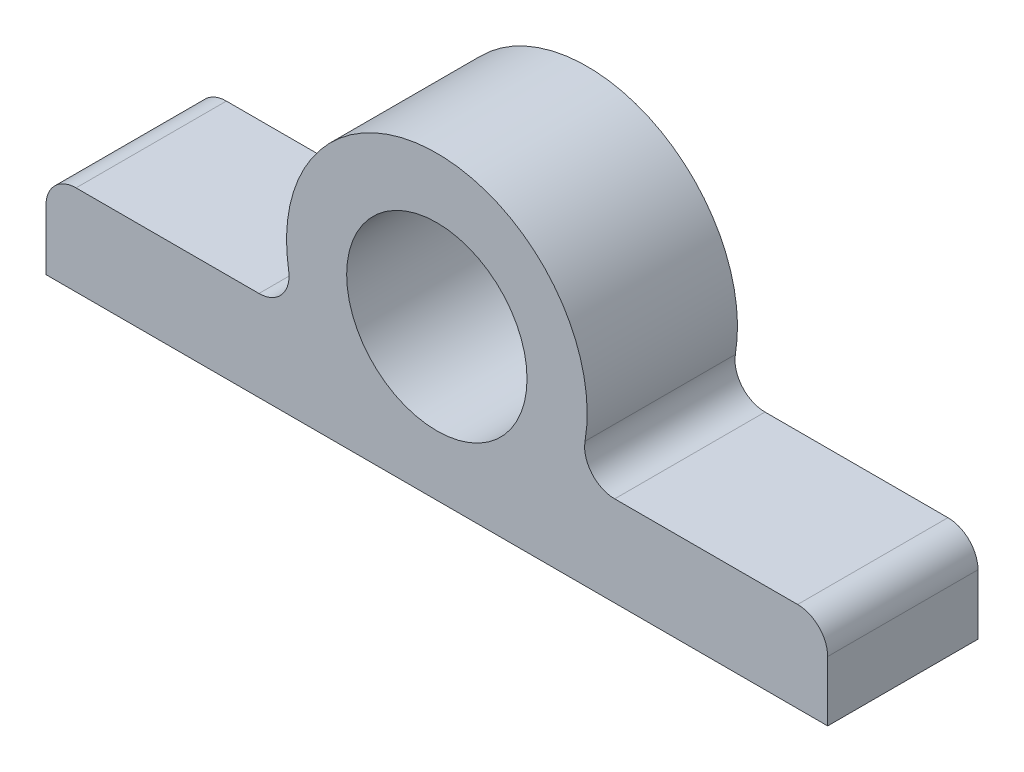
ISO-10303-21;
HEADER;
FILE_DESCRIPTION(('STEP AP214'),'2;1');
FILE_NAME('part.step','',(''),(''),'','','');
FILE_SCHEMA(('AUTOMOTIVE_DESIGN { 1 0 10303 214 1 1 1 1 }'));
ENDSEC;
DATA;
#1=APPLICATION_CONTEXT('core data for automotive mechanical design processes');
#2=APPLICATION_PROTOCOL_DEFINITION('international standard','automotive_design',2000,#1);
#3=PRODUCT_CONTEXT('',#1,'mechanical');
#4=PRODUCT('Part','Part','',(#3));
#5=PRODUCT_RELATED_PRODUCT_CATEGORY('part','',(#4));
#6=PRODUCT_DEFINITION_FORMATION('','',#4);
#7=PRODUCT_DEFINITION_CONTEXT('part definition',#1,'design');
#8=PRODUCT_DEFINITION('design','',#6,#7);
#9=PRODUCT_DEFINITION_SHAPE('','',#8);
#10=(LENGTH_UNIT() NAMED_UNIT(*) SI_UNIT(.MILLI.,.METRE.));
#11=(NAMED_UNIT(*) PLANE_ANGLE_UNIT() SI_UNIT($,.RADIAN.));
#12=(NAMED_UNIT(*) SI_UNIT($,.STERADIAN.) SOLID_ANGLE_UNIT());
#13=UNCERTAINTY_MEASURE_WITH_UNIT(LENGTH_MEASURE(1.E-05),#10,'distance_accuracy_value','');
#14=(GEOMETRIC_REPRESENTATION_CONTEXT(3) GLOBAL_UNCERTAINTY_ASSIGNED_CONTEXT((#13)) GLOBAL_UNIT_ASSIGNED_CONTEXT((#10,
#11,#12)) REPRESENTATION_CONTEXT('',''));
#15=CARTESIAN_POINT('',(0.,0.,0.));
#16=DIRECTION('',(0.,0.,1.));
#17=DIRECTION('',(1.,0.,0.));
#18=AXIS2_PLACEMENT_3D('',#15,#16,#17);
#19=CARTESIAN_POINT('',(29.5803989154981,-5.,25.));
#20=DIRECTION('',(0.,0.,-1.));
#21=DIRECTION('',(-1.,0.,0.));
#22=AXIS2_PLACEMENT_3D('',#19,#20,#21);
#23=PLANE('',#22);
#24=CARTESIAN_POINT('',(29.5803989154981,-5.,25.));
#25=DIRECTION('',(0.,0.,-1.));
#26=DIRECTION('',(-1.,0.,0.));
#27=AXIS2_PLACEMENT_3D('',#24,#25,#26);
#28=CIRCLE('',#27,5.);
#29=CARTESIAN_POINT('',(29.5803989154981,-10.,25.));
#30=VERTEX_POINT('',#29);
#31=CARTESIAN_POINT('',(24.6503324295817,-4.16666666666668,25.));
#32=VERTEX_POINT('',#31);
#33=EDGE_CURVE('E159',#30,#32,#28,.T.);
#34=ORIENTED_EDGE('',*,*,#33,.T.);
#35=CARTESIAN_POINT('',(0.,0.,25.));
#36=DIRECTION('',(0.,0.,1.));
#37=DIRECTION('',(1.,0.,0.));
#38=AXIS2_PLACEMENT_3D('',#35,#36,#37);
#39=CIRCLE('',#38,25.);
#40=CARTESIAN_POINT('',(-24.6503324295817,-4.16666666666667,25.));
#41=VERTEX_POINT('',#40);
#42=EDGE_CURVE('E97',#32,#41,#39,.T.);
#43=ORIENTED_EDGE('',*,*,#42,.T.);
#44=CARTESIAN_POINT('',(-29.5803989154981,-5.,25.));
#45=DIRECTION('',(0.,0.,-1.));
#46=DIRECTION('',(1.,0.,0.));
#47=AXIS2_PLACEMENT_3D('',#44,#45,#46);
#48=CIRCLE('',#47,5.);
#49=CARTESIAN_POINT('',(-29.5803989154981,-10.,25.));
#50=VERTEX_POINT('',#49);
#51=EDGE_CURVE('E180',#41,#50,#48,.T.);
#52=ORIENTED_EDGE('',*,*,#51,.T.);
#53=DIRECTION('',(-1.,0.,0.));
#54=VECTOR('',#53,1.);
#55=CARTESIAN_POINT('',(-60.,-10.,25.));
#56=LINE('',#55,#54);
#57=CARTESIAN_POINT('',(-60.,-10.,25.));
#58=VERTEX_POINT('',#57);
#59=EDGE_CURVE('E199',#50,#58,#56,.T.);
#60=ORIENTED_EDGE('',*,*,#59,.T.);
#61=CARTESIAN_POINT('',(-60.,-15.,25.));
#62=DIRECTION('',(0.,0.,1.));
#63=DIRECTION('',(-1.,0.,0.));
#64=AXIS2_PLACEMENT_3D('',#61,#62,#63);
#65=CIRCLE('',#64,5.);
#66=CARTESIAN_POINT('',(-65.,-15.,25.));
#67=VERTEX_POINT('',#66);
#68=EDGE_CURVE('E196',#58,#67,#65,.T.);
#69=ORIENTED_EDGE('',*,*,#68,.T.);
#70=DIRECTION('',(0.,-1.,0.));
#71=VECTOR('',#70,1.);
#72=CARTESIAN_POINT('',(-65.,-25.,25.));
#73=LINE('',#72,#71);
#74=CARTESIAN_POINT('',(-65.,-25.,25.));
#75=VERTEX_POINT('',#74);
#76=EDGE_CURVE('E198',#67,#75,#73,.T.);
#77=ORIENTED_EDGE('',*,*,#76,.T.);
#78=DIRECTION('',(1.,0.,0.));
#79=VECTOR('',#78,1.);
#80=CARTESIAN_POINT('',(-65.,-25.,25.));
#81=LINE('',#80,#79);
#82=CARTESIAN_POINT('',(65.,-25.,25.));
#83=VERTEX_POINT('',#82);
#84=EDGE_CURVE('E122',#75,#83,#81,.T.);
#85=ORIENTED_EDGE('',*,*,#84,.T.);
#86=DIRECTION('',(0.,1.,0.));
#87=VECTOR('',#86,1.);
#88=CARTESIAN_POINT('',(65.,-25.,25.));
#89=LINE('',#88,#87);
#90=CARTESIAN_POINT('',(65.,-15.,25.));
#91=VERTEX_POINT('',#90);
#92=EDGE_CURVE('E116',#83,#91,#89,.T.);
#93=ORIENTED_EDGE('',*,*,#92,.T.);
#94=CARTESIAN_POINT('',(60.,-15.,25.));
#95=DIRECTION('',(0.,0.,1.));
#96=DIRECTION('',(1.,0.,0.));
#97=AXIS2_PLACEMENT_3D('',#94,#95,#96);
#98=CIRCLE('',#97,5.);
#99=CARTESIAN_POINT('',(60.,-10.,25.));
#100=VERTEX_POINT('',#99);
#101=EDGE_CURVE('E120',#91,#100,#98,.T.);
#102=ORIENTED_EDGE('',*,*,#101,.T.);
#103=DIRECTION('',(-1.,0.,0.));
#104=VECTOR('',#103,1.);
#105=CARTESIAN_POINT('',(60.,-10.,25.));
#106=LINE('',#105,#104);
#107=EDGE_CURVE('E48',#100,#30,#106,.T.);
#108=ORIENTED_EDGE('',*,*,#107,.T.);
#109=EDGE_LOOP('',(#34,#43,#52,#60,#69,#77,#85,#93,#102,#108));
#110=FACE_BOUND('',#109,.T.);
#111=CARTESIAN_POINT('',(0.,0.,25.));
#112=DIRECTION('',(0.,0.,1.));
#113=DIRECTION('',(1.,0.,0.));
#114=AXIS2_PLACEMENT_3D('',#111,#112,#113);
#115=CIRCLE('',#114,15.);
#116=CARTESIAN_POINT('',(15.,0.,25.));
#117=VERTEX_POINT('',#116);
#118=EDGE_CURVE('E144',#117,#117,#115,.T.);
#119=ORIENTED_EDGE('',*,*,#118,.F.);
#120=EDGE_LOOP('',(#119));
#121=FACE_BOUND('',#120,.T.);
#122=ADVANCED_FACE('F31',(#110,#121),#23,.F.);
#123=CARTESIAN_POINT('',(29.5803989154981,-5.,0.));
#124=DIRECTION('',(0.,0.,-1.));
#125=DIRECTION('',(-1.,0.,0.));
#126=AXIS2_PLACEMENT_3D('',#123,#124,#125);
#127=PLANE('',#126);
#128=CARTESIAN_POINT('',(29.5803989154981,-5.,0.));
#129=DIRECTION('',(0.,0.,-1.));
#130=DIRECTION('',(-1.,0.,0.));
#131=AXIS2_PLACEMENT_3D('',#128,#129,#130);
#132=CIRCLE('',#131,5.);
#133=CARTESIAN_POINT('',(29.5803989154981,-10.,0.));
#134=VERTEX_POINT('',#133);
#135=CARTESIAN_POINT('',(24.6503324295817,-4.16666666666668,0.));
#136=VERTEX_POINT('',#135);
#137=EDGE_CURVE('E140',#134,#136,#132,.T.);
#138=ORIENTED_EDGE('',*,*,#137,.F.);
#139=DIRECTION('',(-1.,0.,0.));
#140=VECTOR('',#139,1.);
#141=CARTESIAN_POINT('',(60.,-10.,0.));
#142=LINE('',#141,#140);
#143=CARTESIAN_POINT('',(60.,-10.,0.));
#144=VERTEX_POINT('',#143);
#145=EDGE_CURVE('E89',#144,#134,#142,.T.);
#146=ORIENTED_EDGE('',*,*,#145,.F.);
#147=CARTESIAN_POINT('',(60.,-15.,0.));
#148=DIRECTION('',(0.,0.,1.));
#149=DIRECTION('',(1.,0.,0.));
#150=AXIS2_PLACEMENT_3D('',#147,#148,#149);
#151=CIRCLE('',#150,5.);
#152=CARTESIAN_POINT('',(65.,-15.,0.));
#153=VERTEX_POINT('',#152);
#154=EDGE_CURVE('E83',#153,#144,#151,.T.);
#155=ORIENTED_EDGE('',*,*,#154,.F.);
#156=DIRECTION('',(0.,1.,0.));
#157=VECTOR('',#156,1.);
#158=CARTESIAN_POINT('',(65.,-25.,0.));
#159=LINE('',#158,#157);
#160=CARTESIAN_POINT('',(65.,-25.,0.));
#161=VERTEX_POINT('',#160);
#162=EDGE_CURVE('E130',#161,#153,#159,.T.);
#163=ORIENTED_EDGE('',*,*,#162,.F.);
#164=DIRECTION('',(1.,0.,0.));
#165=VECTOR('',#164,1.);
#166=CARTESIAN_POINT('',(-65.,-25.,0.));
#167=LINE('',#166,#165);
#168=CARTESIAN_POINT('',(-65.,-25.,0.));
#169=VERTEX_POINT('',#168);
#170=EDGE_CURVE('E154',#169,#161,#167,.T.);
#171=ORIENTED_EDGE('',*,*,#170,.F.);
#172=DIRECTION('',(0.,-1.,0.));
#173=VECTOR('',#172,1.);
#174=CARTESIAN_POINT('',(-65.,-25.,0.));
#175=LINE('',#174,#173);
#176=CARTESIAN_POINT('',(-65.,-15.,0.));
#177=VERTEX_POINT('',#176);
#178=EDGE_CURVE('E152',#177,#169,#175,.T.);
#179=ORIENTED_EDGE('',*,*,#178,.F.);
#180=CARTESIAN_POINT('',(-60.,-15.,0.));
#181=DIRECTION('',(0.,0.,1.));
#182=DIRECTION('',(-1.,0.,0.));
#183=AXIS2_PLACEMENT_3D('',#180,#181,#182);
#184=CIRCLE('',#183,5.);
#185=CARTESIAN_POINT('',(-60.,-10.,0.));
#186=VERTEX_POINT('',#185);
#187=EDGE_CURVE('E150',#186,#177,#184,.T.);
#188=ORIENTED_EDGE('',*,*,#187,.F.);
#189=DIRECTION('',(-1.,0.,0.));
#190=VECTOR('',#189,1.);
#191=CARTESIAN_POINT('',(-60.,-10.,0.));
#192=LINE('',#191,#190);
#193=CARTESIAN_POINT('',(-29.5803989154981,-10.,0.));
#194=VERTEX_POINT('',#193);
#195=EDGE_CURVE('E148',#194,#186,#192,.T.);
#196=ORIENTED_EDGE('',*,*,#195,.F.);
#197=CARTESIAN_POINT('',(-29.5803989154981,-5.,0.));
#198=DIRECTION('',(0.,0.,-1.));
#199=DIRECTION('',(1.,0.,0.));
#200=AXIS2_PLACEMENT_3D('',#197,#198,#199);
#201=CIRCLE('',#200,5.);
#202=CARTESIAN_POINT('',(-24.6503324295817,-4.16666666666667,0.));
#203=VERTEX_POINT('',#202);
#204=EDGE_CURVE('E146',#203,#194,#201,.T.);
#205=ORIENTED_EDGE('',*,*,#204,.F.);
#206=CARTESIAN_POINT('',(0.,0.,0.));
#207=DIRECTION('',(0.,0.,1.));
#208=DIRECTION('',(1.,0.,0.));
#209=AXIS2_PLACEMENT_3D('',#206,#207,#208);
#210=CIRCLE('',#209,25.);
#211=EDGE_CURVE('E143',#136,#203,#210,.T.);
#212=ORIENTED_EDGE('',*,*,#211,.F.);
#213=EDGE_LOOP('',(#138,#146,#155,#163,#171,#179,#188,#196,#205,#212));
#214=FACE_BOUND('',#213,.T.);
#215=CARTESIAN_POINT('',(0.,0.,0.));
#216=DIRECTION('',(0.,0.,1.));
#217=DIRECTION('',(1.,0.,0.));
#218=AXIS2_PLACEMENT_3D('',#215,#216,#217);
#219=CIRCLE('',#218,15.);
#220=CARTESIAN_POINT('',(15.,0.,0.));
#221=VERTEX_POINT('',#220);
#222=EDGE_CURVE('E207',#221,#221,#219,.T.);
#223=ORIENTED_EDGE('',*,*,#222,.T.);
#224=EDGE_LOOP('',(#223));
#225=FACE_BOUND('',#224,.T.);
#226=ADVANCED_FACE('F184',(#214,#225),#127,.T.);
#227=CARTESIAN_POINT('',(29.5803989154981,-5.,25.));
#228=DIRECTION('',(0.,0.,-1.));
#229=DIRECTION('',(-1.,0.,0.));
#230=AXIS2_PLACEMENT_3D('',#227,#228,#229);
#231=CYLINDRICAL_SURFACE('',#230,5.);
#232=ORIENTED_EDGE('',*,*,#137,.T.);
#233=DIRECTION('',(0.,0.,-1.));
#234=VECTOR('',#233,1.);
#235=CARTESIAN_POINT('',(24.6503324295817,-4.16666666666668,25.));
#236=LINE('',#235,#234);
#237=EDGE_CURVE('E11',#32,#136,#236,.T.);
#238=ORIENTED_EDGE('',*,*,#237,.F.);
#239=ORIENTED_EDGE('',*,*,#33,.F.);
#240=DIRECTION('',(0.,0.,-1.));
#241=VECTOR('',#240,1.);
#242=CARTESIAN_POINT('',(29.5803989154981,-10.,25.));
#243=LINE('',#242,#241);
#244=EDGE_CURVE('E136',#30,#134,#243,.T.);
#245=ORIENTED_EDGE('',*,*,#244,.T.);
#246=EDGE_LOOP('',(#232,#238,#239,#245));
#247=FACE_BOUND('',#246,.T.);
#248=ADVANCED_FACE('F33',(#247),#231,.F.);
#249=CARTESIAN_POINT('',(0.,0.,25.));
#250=DIRECTION('',(0.,0.,-1.));
#251=DIRECTION('',(-1.,0.,0.));
#252=AXIS2_PLACEMENT_3D('',#249,#250,#251);
#253=CYLINDRICAL_SURFACE('',#252,25.);
#254=ORIENTED_EDGE('',*,*,#211,.T.);
#255=DIRECTION('',(0.,0.,-1.));
#256=VECTOR('',#255,1.);
#257=CARTESIAN_POINT('',(-24.6503324295817,-4.16666666666667,25.));
#258=LINE('',#257,#256);
#259=EDGE_CURVE('E40',#41,#203,#258,.T.);
#260=ORIENTED_EDGE('',*,*,#259,.F.);
#261=ORIENTED_EDGE('',*,*,#42,.F.);
#262=ORIENTED_EDGE('',*,*,#237,.T.);
#263=EDGE_LOOP('',(#254,#260,#261,#262));
#264=FACE_BOUND('',#263,.T.);
#265=ADVANCED_FACE('F243',(#264),#253,.T.);
#266=CARTESIAN_POINT('',(-29.5803989154981,-5.,25.));
#267=DIRECTION('',(0.,0.,-1.));
#268=DIRECTION('',(-1.,0.,0.));
#269=AXIS2_PLACEMENT_3D('',#266,#267,#268);
#270=CYLINDRICAL_SURFACE('',#269,5.);
#271=ORIENTED_EDGE('',*,*,#204,.T.);
#272=DIRECTION('',(0.,0.,-1.));
#273=VECTOR('',#272,1.);
#274=CARTESIAN_POINT('',(-29.5803989154981,-10.,25.));
#275=LINE('',#274,#273);
#276=EDGE_CURVE('E172',#50,#194,#275,.T.);
#277=ORIENTED_EDGE('',*,*,#276,.F.);
#278=ORIENTED_EDGE('',*,*,#51,.F.);
#279=ORIENTED_EDGE('',*,*,#259,.T.);
#280=EDGE_LOOP('',(#271,#277,#278,#279));
#281=FACE_BOUND('',#280,.T.);
#282=ADVANCED_FACE('F178',(#281),#270,.F.);
#283=CARTESIAN_POINT('',(-60.,-10.,25.));
#284=DIRECTION('',(0.,-1.,0.));
#285=DIRECTION('',(0.,0.,-1.));
#286=AXIS2_PLACEMENT_3D('',#283,#284,#285);
#287=PLANE('',#286);
#288=ORIENTED_EDGE('',*,*,#195,.T.);
#289=DIRECTION('',(0.,0.,-1.));
#290=VECTOR('',#289,1.);
#291=CARTESIAN_POINT('',(-60.,-10.,25.));
#292=LINE('',#291,#290);
#293=EDGE_CURVE('E169',#58,#186,#292,.T.);
#294=ORIENTED_EDGE('',*,*,#293,.F.);
#295=ORIENTED_EDGE('',*,*,#59,.F.);
#296=ORIENTED_EDGE('',*,*,#276,.T.);
#297=EDGE_LOOP('',(#288,#294,#295,#296));
#298=FACE_BOUND('',#297,.T.);
#299=ADVANCED_FACE('F190',(#298),#287,.F.);
#300=CARTESIAN_POINT('',(-60.,-15.,25.));
#301=DIRECTION('',(0.,0.,-1.));
#302=DIRECTION('',(-1.,0.,0.));
#303=AXIS2_PLACEMENT_3D('',#300,#301,#302);
#304=CYLINDRICAL_SURFACE('',#303,5.);
#305=ORIENTED_EDGE('',*,*,#187,.T.);
#306=DIRECTION('',(0.,0.,-1.));
#307=VECTOR('',#306,1.);
#308=CARTESIAN_POINT('',(-65.,-15.,25.));
#309=LINE('',#308,#307);
#310=EDGE_CURVE('E166',#67,#177,#309,.T.);
#311=ORIENTED_EDGE('',*,*,#310,.F.);
#312=ORIENTED_EDGE('',*,*,#68,.F.);
#313=ORIENTED_EDGE('',*,*,#293,.T.);
#314=EDGE_LOOP('',(#305,#311,#312,#313));
#315=FACE_BOUND('',#314,.T.);
#316=ADVANCED_FACE('F194',(#315),#304,.T.);
#317=CARTESIAN_POINT('',(-65.,-25.,25.));
#318=DIRECTION('',(1.,0.,0.));
#319=DIRECTION('',(0.,0.,-1.));
#320=AXIS2_PLACEMENT_3D('',#317,#318,#319);
#321=PLANE('',#320);
#322=ORIENTED_EDGE('',*,*,#178,.T.);
#323=DIRECTION('',(0.,0.,-1.));
#324=VECTOR('',#323,1.);
#325=CARTESIAN_POINT('',(-65.,-25.,25.));
#326=LINE('',#325,#324);
#327=EDGE_CURVE('E163',#75,#169,#326,.T.);
#328=ORIENTED_EDGE('',*,*,#327,.F.);
#329=ORIENTED_EDGE('',*,*,#76,.F.);
#330=ORIENTED_EDGE('',*,*,#310,.T.);
#331=EDGE_LOOP('',(#322,#328,#329,#330));
#332=FACE_BOUND('',#331,.T.);
#333=ADVANCED_FACE('F233',(#332),#321,.F.);
#334=CARTESIAN_POINT('',(-65.,-25.,25.));
#335=DIRECTION('',(0.,1.,0.));
#336=DIRECTION('',(0.,0.,1.));
#337=AXIS2_PLACEMENT_3D('',#334,#335,#336);
#338=PLANE('',#337);
#339=ORIENTED_EDGE('',*,*,#170,.T.);
#340=DIRECTION('',(0.,0.,-1.));
#341=VECTOR('',#340,1.);
#342=CARTESIAN_POINT('',(65.,-25.,25.));
#343=LINE('',#342,#341);
#344=EDGE_CURVE('E131',#83,#161,#343,.T.);
#345=ORIENTED_EDGE('',*,*,#344,.F.);
#346=ORIENTED_EDGE('',*,*,#84,.F.);
#347=ORIENTED_EDGE('',*,*,#327,.T.);
#348=EDGE_LOOP('',(#339,#345,#346,#347));
#349=FACE_BOUND('',#348,.T.);
#350=ADVANCED_FACE('F230',(#349),#338,.F.);
#351=CARTESIAN_POINT('',(65.,-25.,25.));
#352=DIRECTION('',(-1.,0.,0.));
#353=DIRECTION('',(0.,0.,1.));
#354=AXIS2_PLACEMENT_3D('',#351,#352,#353);
#355=PLANE('',#354);
#356=ORIENTED_EDGE('',*,*,#162,.T.);
#357=DIRECTION('',(0.,0.,-1.));
#358=VECTOR('',#357,1.);
#359=CARTESIAN_POINT('',(65.,-15.,25.));
#360=LINE('',#359,#358);
#361=EDGE_CURVE('E127',#91,#153,#360,.T.);
#362=ORIENTED_EDGE('',*,*,#361,.F.);
#363=ORIENTED_EDGE('',*,*,#92,.F.);
#364=ORIENTED_EDGE('',*,*,#344,.T.);
#365=EDGE_LOOP('',(#356,#362,#363,#364));
#366=FACE_BOUND('',#365,.T.);
#367=ADVANCED_FACE('F128',(#366),#355,.F.);
#368=CARTESIAN_POINT('',(60.,-15.,25.));
#369=DIRECTION('',(0.,0.,-1.));
#370=DIRECTION('',(-1.,0.,0.));
#371=AXIS2_PLACEMENT_3D('',#368,#369,#370);
#372=CYLINDRICAL_SURFACE('',#371,5.);
#373=ORIENTED_EDGE('',*,*,#154,.T.);
#374=DIRECTION('',(0.,0.,-1.));
#375=VECTOR('',#374,1.);
#376=CARTESIAN_POINT('',(60.,-10.,25.));
#377=LINE('',#376,#375);
#378=EDGE_CURVE('E132',#100,#144,#377,.T.);
#379=ORIENTED_EDGE('',*,*,#378,.F.);
#380=ORIENTED_EDGE('',*,*,#101,.F.);
#381=ORIENTED_EDGE('',*,*,#361,.T.);
#382=EDGE_LOOP('',(#373,#379,#380,#381));
#383=FACE_BOUND('',#382,.T.);
#384=ADVANCED_FACE('F134',(#383),#372,.T.);
#385=CARTESIAN_POINT('',(60.,-10.,25.));
#386=DIRECTION('',(0.,-1.,0.));
#387=DIRECTION('',(0.,0.,-1.));
#388=AXIS2_PLACEMENT_3D('',#385,#386,#387);
#389=PLANE('',#388);
#390=ORIENTED_EDGE('',*,*,#145,.T.);
#391=ORIENTED_EDGE('',*,*,#244,.F.);
#392=ORIENTED_EDGE('',*,*,#107,.F.);
#393=ORIENTED_EDGE('',*,*,#378,.T.);
#394=EDGE_LOOP('',(#390,#391,#392,#393));
#395=FACE_BOUND('',#394,.T.);
#396=ADVANCED_FACE('F223',(#395),#389,.F.);
#397=CARTESIAN_POINT('',(0.,0.,25.));
#398=DIRECTION('',(0.,0.,-1.));
#399=DIRECTION('',(-1.,0.,0.));
#400=AXIS2_PLACEMENT_3D('',#397,#398,#399);
#401=CYLINDRICAL_SURFACE('',#400,15.);
#402=ORIENTED_EDGE('',*,*,#118,.T.);
#403=EDGE_LOOP('',(#402));
#404=FACE_BOUND('',#403,.T.);
#405=ORIENTED_EDGE('',*,*,#222,.F.);
#406=EDGE_LOOP('',(#405));
#407=FACE_BOUND('',#406,.T.);
#408=ADVANCED_FACE('F213',(#404,#407),#401,.F.);
#409=CLOSED_SHELL('',(#122,#226,#248,#265,#282,#299,#316,#333,#350,#367,#384,#396,#408));
#410=MANIFOLD_SOLID_BREP('B2',#409);
#411=ADVANCED_BREP_SHAPE_REPRESENTATION('',(#18,#410),#14);
#412=SHAPE_DEFINITION_REPRESENTATION(#9,#411);
ENDSEC;
END-ISO-10303-21;
